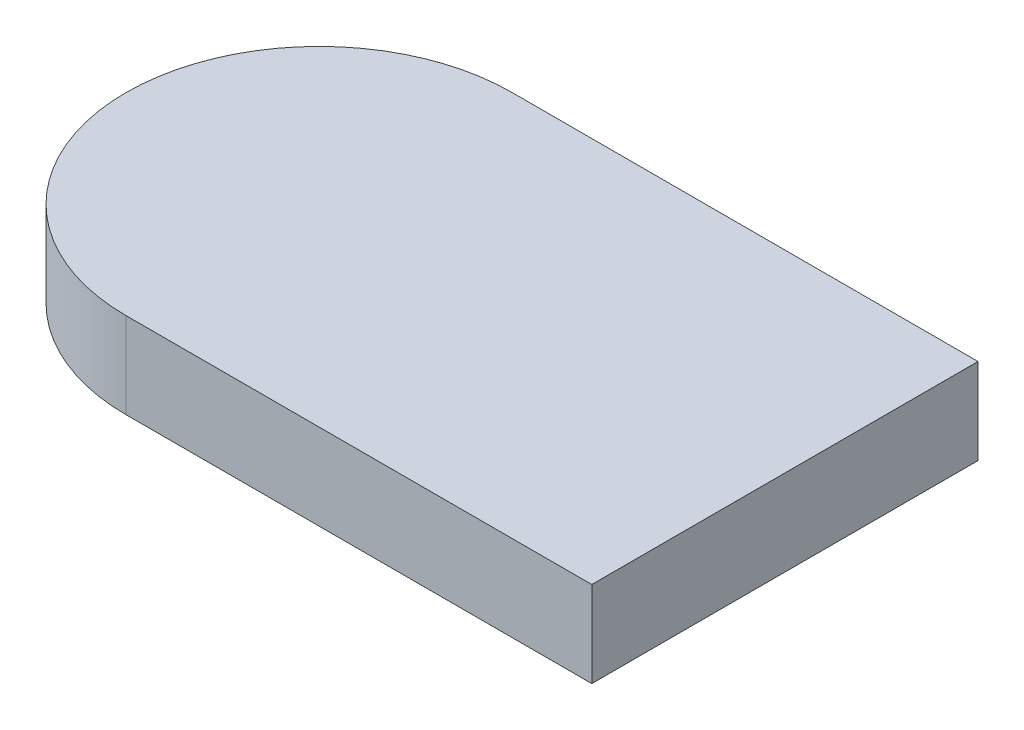
ISO-10303-21;
HEADER;
FILE_DESCRIPTION(('STEP AP214'),'2;1');
FILE_NAME('part.step','',(''),(''),'','','');
FILE_SCHEMA(('AUTOMOTIVE_DESIGN { 1 0 10303 214 1 1 1 1 }'));
ENDSEC;
DATA;
#1=APPLICATION_CONTEXT('core data for automotive mechanical design processes');
#2=APPLICATION_PROTOCOL_DEFINITION('international standard','automotive_design',2000,#1);
#3=PRODUCT_CONTEXT('',#1,'mechanical');
#4=PRODUCT('Part','Part','',(#3));
#5=PRODUCT_RELATED_PRODUCT_CATEGORY('part','',(#4));
#6=PRODUCT_DEFINITION_FORMATION('','',#4);
#7=PRODUCT_DEFINITION_CONTEXT('part definition',#1,'design');
#8=PRODUCT_DEFINITION('design','',#6,#7);
#9=PRODUCT_DEFINITION_SHAPE('','',#8);
#10=(LENGTH_UNIT() NAMED_UNIT(*) SI_UNIT(.MILLI.,.METRE.));
#11=(NAMED_UNIT(*) PLANE_ANGLE_UNIT() SI_UNIT($,.RADIAN.));
#12=(NAMED_UNIT(*) SI_UNIT($,.STERADIAN.) SOLID_ANGLE_UNIT());
#13=UNCERTAINTY_MEASURE_WITH_UNIT(LENGTH_MEASURE(1.E-05),#10,'distance_accuracy_value','');
#14=(GEOMETRIC_REPRESENTATION_CONTEXT(3) GLOBAL_UNCERTAINTY_ASSIGNED_CONTEXT((#13)) GLOBAL_UNIT_ASSIGNED_CONTEXT((#10,
#11,#12)) REPRESENTATION_CONTEXT('',''));
#15=CARTESIAN_POINT('',(0.,0.,0.));
#16=DIRECTION('',(0.,0.,1.));
#17=DIRECTION('',(1.,0.,0.));
#18=AXIS2_PLACEMENT_3D('',#15,#16,#17);
#19=CARTESIAN_POINT('',(0.,40.,0.));
#20=DIRECTION('',(0.,-1.,0.));
#21=DIRECTION('',(0.,0.,-1.));
#22=AXIS2_PLACEMENT_3D('',#19,#20,#21);
#23=CYLINDRICAL_SURFACE('',#22,90.);
#24=CARTESIAN_POINT('',(0.,0.,0.));
#25=DIRECTION('',(0.,1.,0.));
#26=DIRECTION('',(0.,0.,-1.));
#27=AXIS2_PLACEMENT_3D('',#24,#25,#26);
#28=CIRCLE('',#27,90.);
#29=CARTESIAN_POINT('',(0.,0.,-90.));
#30=VERTEX_POINT('',#29);
#31=CARTESIAN_POINT('',(0.,0.,90.));
#32=VERTEX_POINT('',#31);
#33=EDGE_CURVE('E107',#30,#32,#28,.T.);
#34=ORIENTED_EDGE('',*,*,#33,.T.);
#35=DIRECTION('',(0.,-1.,0.));
#36=VECTOR('',#35,1.);
#37=CARTESIAN_POINT('',(0.,40.,90.));
#38=LINE('',#37,#36);
#39=CARTESIAN_POINT('',(0.,40.,90.));
#40=VERTEX_POINT('',#39);
#41=EDGE_CURVE('E11',#40,#32,#38,.T.);
#42=ORIENTED_EDGE('',*,*,#41,.F.);
#43=CARTESIAN_POINT('',(0.,40.,0.));
#44=DIRECTION('',(0.,1.,0.));
#45=DIRECTION('',(0.,0.,-1.));
#46=AXIS2_PLACEMENT_3D('',#43,#44,#45);
#47=CIRCLE('',#46,90.);
#48=CARTESIAN_POINT('',(0.,40.,-90.));
#49=VERTEX_POINT('',#48);
#50=EDGE_CURVE('E91',#49,#40,#47,.T.);
#51=ORIENTED_EDGE('',*,*,#50,.F.);
#52=DIRECTION('',(0.,-1.,0.));
#53=VECTOR('',#52,1.);
#54=CARTESIAN_POINT('',(0.,40.,-90.));
#55=LINE('',#54,#53);
#56=EDGE_CURVE('E103',#49,#30,#55,.T.);
#57=ORIENTED_EDGE('',*,*,#56,.T.);
#58=EDGE_LOOP('',(#34,#42,#51,#57));
#59=FACE_BOUND('',#58,.T.);
#60=ADVANCED_FACE('F39',(#59),#23,.T.);
#61=CARTESIAN_POINT('',(217.08,40.,90.));
#62=DIRECTION('',(0.,0.,-1.));
#63=DIRECTION('',(-1.,0.,0.));
#64=AXIS2_PLACEMENT_3D('',#61,#62,#63);
#65=PLANE('',#64);
#66=DIRECTION('',(1.,0.,0.));
#67=VECTOR('',#66,1.);
#68=CARTESIAN_POINT('',(217.08,0.,90.));
#69=LINE('',#68,#67);
#70=CARTESIAN_POINT('',(217.08,0.,90.));
#71=VERTEX_POINT('',#70);
#72=EDGE_CURVE('E96',#32,#71,#69,.T.);
#73=ORIENTED_EDGE('',*,*,#72,.T.);
#74=DIRECTION('',(0.,-1.,0.));
#75=VECTOR('',#74,1.);
#76=CARTESIAN_POINT('',(217.08,40.,90.));
#77=LINE('',#76,#75);
#78=CARTESIAN_POINT('',(217.08,40.,90.));
#79=VERTEX_POINT('',#78);
#80=EDGE_CURVE('E48',#79,#71,#77,.T.);
#81=ORIENTED_EDGE('',*,*,#80,.F.);
#82=DIRECTION('',(1.,0.,0.));
#83=VECTOR('',#82,1.);
#84=CARTESIAN_POINT('',(217.08,40.,90.));
#85=LINE('',#84,#83);
#86=EDGE_CURVE('E86',#40,#79,#85,.T.);
#87=ORIENTED_EDGE('',*,*,#86,.F.);
#88=ORIENTED_EDGE('',*,*,#41,.T.);
#89=EDGE_LOOP('',(#73,#81,#87,#88));
#90=FACE_BOUND('',#89,.T.);
#91=ADVANCED_FACE('F95',(#90),#65,.F.);
#92=CARTESIAN_POINT('',(217.08,40.,-90.));
#93=DIRECTION('',(-1.,0.,0.));
#94=DIRECTION('',(0.,0.,1.));
#95=AXIS2_PLACEMENT_3D('',#92,#93,#94);
#96=PLANE('',#95);
#97=DIRECTION('',(0.,0.,-1.));
#98=VECTOR('',#97,1.);
#99=CARTESIAN_POINT('',(217.08,0.,-90.));
#100=LINE('',#99,#98);
#101=CARTESIAN_POINT('',(217.08,0.,-90.));
#102=VERTEX_POINT('',#101);
#103=EDGE_CURVE('E73',#71,#102,#100,.T.);
#104=ORIENTED_EDGE('',*,*,#103,.T.);
#105=DIRECTION('',(0.,-1.,0.));
#106=VECTOR('',#105,1.);
#107=CARTESIAN_POINT('',(217.08,40.,-90.));
#108=LINE('',#107,#106);
#109=CARTESIAN_POINT('',(217.08,40.,-90.));
#110=VERTEX_POINT('',#109);
#111=EDGE_CURVE('E98',#110,#102,#108,.T.);
#112=ORIENTED_EDGE('',*,*,#111,.F.);
#113=DIRECTION('',(0.,0.,-1.));
#114=VECTOR('',#113,1.);
#115=CARTESIAN_POINT('',(217.08,40.,-90.));
#116=LINE('',#115,#114);
#117=EDGE_CURVE('E89',#79,#110,#116,.T.);
#118=ORIENTED_EDGE('',*,*,#117,.F.);
#119=ORIENTED_EDGE('',*,*,#80,.T.);
#120=EDGE_LOOP('',(#104,#112,#118,#119));
#121=FACE_BOUND('',#120,.T.);
#122=ADVANCED_FACE('F99',(#121),#96,.F.);
#123=CARTESIAN_POINT('',(0.,40.,-90.));
#124=DIRECTION('',(0.,0.,1.));
#125=DIRECTION('',(1.,0.,0.));
#126=AXIS2_PLACEMENT_3D('',#123,#124,#125);
#127=PLANE('',#126);
#128=DIRECTION('',(-1.,0.,0.));
#129=VECTOR('',#128,1.);
#130=CARTESIAN_POINT('',(0.,0.,-90.));
#131=LINE('',#130,#129);
#132=EDGE_CURVE('E79',#102,#30,#131,.T.);
#133=ORIENTED_EDGE('',*,*,#132,.T.);
#134=ORIENTED_EDGE('',*,*,#56,.F.);
#135=DIRECTION('',(-1.,0.,0.));
#136=VECTOR('',#135,1.);
#137=CARTESIAN_POINT('',(0.,40.,-90.));
#138=LINE('',#137,#136);
#139=EDGE_CURVE('E56',#110,#49,#138,.T.);
#140=ORIENTED_EDGE('',*,*,#139,.F.);
#141=ORIENTED_EDGE('',*,*,#111,.T.);
#142=EDGE_LOOP('',(#133,#134,#140,#141));
#143=FACE_BOUND('',#142,.T.);
#144=ADVANCED_FACE('F120',(#143),#127,.F.);
#145=CARTESIAN_POINT('',(0.,40.,0.));
#146=DIRECTION('',(0.,-1.,0.));
#147=DIRECTION('',(0.,0.,-1.));
#148=AXIS2_PLACEMENT_3D('',#145,#146,#147);
#149=PLANE('',#148);
#150=ORIENTED_EDGE('',*,*,#50,.T.);
#151=ORIENTED_EDGE('',*,*,#86,.T.);
#152=ORIENTED_EDGE('',*,*,#117,.T.);
#153=ORIENTED_EDGE('',*,*,#139,.T.);
#154=EDGE_LOOP('',(#150,#151,#152,#153));
#155=FACE_BOUND('',#154,.T.);
#156=ADVANCED_FACE('F87',(#155),#149,.F.);
#157=CARTESIAN_POINT('',(0.,0.,0.));
#158=DIRECTION('',(0.,-1.,0.));
#159=DIRECTION('',(0.,0.,-1.));
#160=AXIS2_PLACEMENT_3D('',#157,#158,#159);
#161=PLANE('',#160);
#162=ORIENTED_EDGE('',*,*,#33,.F.);
#163=ORIENTED_EDGE('',*,*,#132,.F.);
#164=ORIENTED_EDGE('',*,*,#103,.F.);
#165=ORIENTED_EDGE('',*,*,#72,.F.);
#166=EDGE_LOOP('',(#162,#163,#164,#165));
#167=FACE_BOUND('',#166,.T.);
#168=ADVANCED_FACE('F123',(#167),#161,.T.);
#169=CLOSED_SHELL('',(#60,#91,#122,#144,#156,#168));
#170=MANIFOLD_SOLID_BREP('B2',#169);
#171=ADVANCED_BREP_SHAPE_REPRESENTATION('',(#18,#170),#14);
#172=SHAPE_DEFINITION_REPRESENTATION(#9,#171);
ENDSEC;
END-ISO-10303-21;
